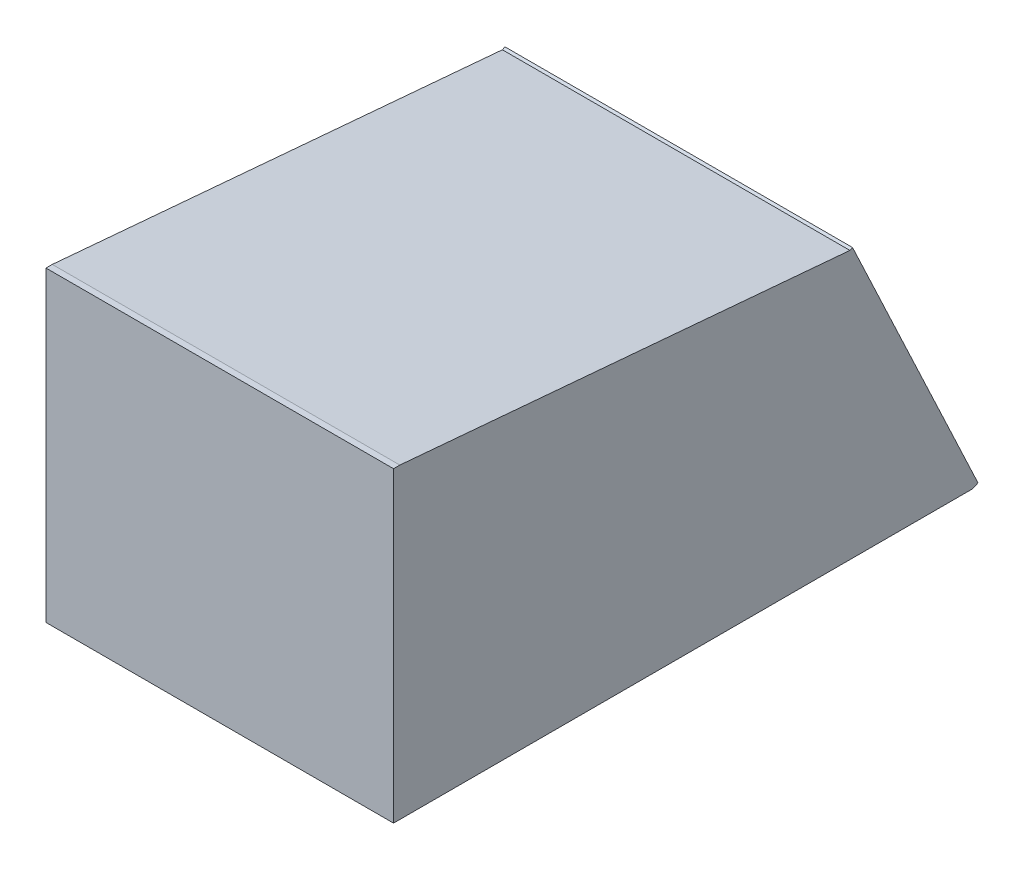
ISO-10303-21;
HEADER;
FILE_DESCRIPTION(('STEP AP214'),'2;1');
FILE_NAME('part.step','',(''),(''),'','','');
FILE_SCHEMA(('AUTOMOTIVE_DESIGN { 1 0 10303 214 1 1 1 1 }'));
ENDSEC;
DATA;
#1=APPLICATION_CONTEXT('core data for automotive mechanical design processes');
#2=APPLICATION_PROTOCOL_DEFINITION('international standard','automotive_design',2000,#1);
#3=PRODUCT_CONTEXT('',#1,'mechanical');
#4=PRODUCT('Part','Part','',(#3));
#5=PRODUCT_RELATED_PRODUCT_CATEGORY('part','',(#4));
#6=PRODUCT_DEFINITION_FORMATION('','',#4);
#7=PRODUCT_DEFINITION_CONTEXT('part definition',#1,'design');
#8=PRODUCT_DEFINITION('design','',#6,#7);
#9=PRODUCT_DEFINITION_SHAPE('','',#8);
#10=(LENGTH_UNIT() NAMED_UNIT(*) SI_UNIT(.MILLI.,.METRE.));
#11=(NAMED_UNIT(*) PLANE_ANGLE_UNIT() SI_UNIT($,.RADIAN.));
#12=(NAMED_UNIT(*) SI_UNIT($,.STERADIAN.) SOLID_ANGLE_UNIT());
#13=UNCERTAINTY_MEASURE_WITH_UNIT(LENGTH_MEASURE(1.E-05),#10,'distance_accuracy_value','');
#14=(GEOMETRIC_REPRESENTATION_CONTEXT(3) GLOBAL_UNCERTAINTY_ASSIGNED_CONTEXT((#13)) GLOBAL_UNIT_ASSIGNED_CONTEXT((#10,
#11,#12)) REPRESENTATION_CONTEXT('',''));
#15=CARTESIAN_POINT('',(0.,0.,0.));
#16=DIRECTION('',(0.,0.,1.));
#17=DIRECTION('',(1.,0.,0.));
#18=AXIS2_PLACEMENT_3D('',#15,#16,#17);
#19=CARTESIAN_POINT('',(5.,-130.,247.5));
#20=DIRECTION('',(0.,1.,0.));
#21=DIRECTION('',(0.,0.,1.));
#22=AXIS2_PLACEMENT_3D('',#19,#20,#21);
#23=PLANE('',#22);
#24=DIRECTION('',(0.,0.,-1.));
#25=VECTOR('',#24,1.);
#26=CARTESIAN_POINT('',(0.,-130.,247.5));
#27=LINE('',#26,#25);
#28=CARTESIAN_POINT('',(0.,-130.,247.5));
#29=VERTEX_POINT('',#28);
#30=CARTESIAN_POINT('',(0.,-130.,-247.5));
#31=VERTEX_POINT('',#30);
#32=EDGE_CURVE('E60',#29,#31,#27,.T.);
#33=ORIENTED_EDGE('',*,*,#32,.T.);
#34=DIRECTION('',(-1.,0.,0.));
#35=VECTOR('',#34,1.);
#36=CARTESIAN_POINT('',(5.,-130.,-247.5));
#37=LINE('',#36,#35);
#38=CARTESIAN_POINT('',(5.,-130.,-247.5));
#39=VERTEX_POINT('',#38);
#40=EDGE_CURVE('E11',#39,#31,#37,.T.);
#41=ORIENTED_EDGE('',*,*,#40,.F.);
#42=DIRECTION('',(0.,0.,-1.));
#43=VECTOR('',#42,1.);
#44=CARTESIAN_POINT('',(5.,-130.,247.5));
#45=LINE('',#44,#43);
#46=CARTESIAN_POINT('',(5.,-130.,252.5));
#47=VERTEX_POINT('',#46);
#48=EDGE_CURVE('E41',#47,#39,#45,.T.);
#49=ORIENTED_EDGE('',*,*,#48,.F.);
#50=DIRECTION('',(1.,0.,0.));
#51=VECTOR('',#50,1.);
#52=CARTESIAN_POINT('',(5.,-130.,252.5));
#53=LINE('',#52,#51);
#54=CARTESIAN_POINT('',(-295.,-130.,252.5));
#55=VERTEX_POINT('',#54);
#56=EDGE_CURVE('E190',#55,#47,#53,.T.);
#57=ORIENTED_EDGE('',*,*,#56,.F.);
#58=DIRECTION('',(0.,0.,1.));
#59=VECTOR('',#58,1.);
#60=CARTESIAN_POINT('',(-295.,-130.,-247.5));
#61=LINE('',#60,#59);
#62=CARTESIAN_POINT('',(-295.,-130.,-247.5));
#63=VERTEX_POINT('',#62);
#64=EDGE_CURVE('E101',#63,#55,#61,.T.);
#65=ORIENTED_EDGE('',*,*,#64,.F.);
#66=DIRECTION('',(-1.,0.,0.));
#67=VECTOR('',#66,1.);
#68=CARTESIAN_POINT('',(-290.,-130.,-247.5));
#69=LINE('',#68,#67);
#70=CARTESIAN_POINT('',(-290.,-130.,-247.5));
#71=VERTEX_POINT('',#70);
#72=EDGE_CURVE('E119',#71,#63,#69,.T.);
#73=ORIENTED_EDGE('',*,*,#72,.F.);
#74=DIRECTION('',(0.,0.,1.));
#75=VECTOR('',#74,1.);
#76=CARTESIAN_POINT('',(-290.,-130.,-247.5));
#77=LINE('',#76,#75);
#78=CARTESIAN_POINT('',(-290.,-130.,247.5));
#79=VERTEX_POINT('',#78);
#80=EDGE_CURVE('E118',#71,#79,#77,.T.);
#81=ORIENTED_EDGE('',*,*,#80,.T.);
#82=DIRECTION('',(1.,0.,0.));
#83=VECTOR('',#82,1.);
#84=CARTESIAN_POINT('',(5.,-130.,247.5));
#85=LINE('',#84,#83);
#86=EDGE_CURVE('E65',#79,#29,#85,.T.);
#87=ORIENTED_EDGE('',*,*,#86,.T.);
#88=EDGE_LOOP('',(#33,#41,#49,#57,#65,#73,#81,#87));
#89=FACE_BOUND('',#88,.T.);
#90=ADVANCED_FACE('F33',(#89),#23,.F.);
#91=CARTESIAN_POINT('',(5.,0.,0.));
#92=DIRECTION('',(1.,0.,0.));
#93=DIRECTION('',(0.,0.,-1.));
#94=AXIS2_PLACEMENT_3D('',#91,#92,#93);
#95=PLANE('',#94);
#96=DIRECTION('',(0.,1.,0.));
#97=VECTOR('',#96,1.);
#98=CARTESIAN_POINT('',(5.,-130.,252.5));
#99=LINE('',#98,#97);
#100=CARTESIAN_POINT('',(5.,134.98118232192,252.5));
#101=VERTEX_POINT('',#100);
#102=EDGE_CURVE('E232',#47,#101,#99,.T.);
#103=ORIENTED_EDGE('',*,*,#102,.F.);
#104=ORIENTED_EDGE('',*,*,#48,.T.);
#105=DIRECTION('',(0.,-0.425871115560859,0.904783837682211));
#106=VECTOR('',#105,1.);
#107=CARTESIAN_POINT('',(5.,-127.870644422196,-252.023919188411));
#108=LINE('',#107,#106);
#109=CARTESIAN_POINT('',(5.,-127.870644422196,-252.023919188411));
#110=VERTEX_POINT('',#109);
#111=EDGE_CURVE('E94',#110,#39,#108,.T.);
#112=ORIENTED_EDGE('',*,*,#111,.F.);
#113=DIRECTION('',(0.,-0.904783837682211,-0.425871115560859));
#114=VECTOR('',#113,1.);
#115=CARTESIAN_POINT('',(5.,-127.870644422196,-252.023919188411));
#116=LINE('',#115,#114);
#117=CARTESIAN_POINT('',(5.,102.236086650973,-143.715386057194));
#118=VERTEX_POINT('',#117);
#119=EDGE_CURVE('E89',#118,#110,#116,.T.);
#120=ORIENTED_EDGE('',*,*,#119,.F.);
#121=DIRECTION('',(0.,-0.425871115560859,0.904783837682211));
#122=VECTOR('',#121,1.);
#123=CARTESIAN_POINT('',(5.,102.236086650973,-143.715386057194));
#124=LINE('',#123,#122);
#125=CARTESIAN_POINT('',(5.,101.177141742473,-141.465606245419));
#126=VERTEX_POINT('',#125);
#127=EDGE_CURVE('E183',#118,#126,#124,.T.);
#128=ORIENTED_EDGE('',*,*,#127,.T.);
#129=DIRECTION('',(0.,-0.086677027126788,-0.996236464384065));
#130=VECTOR('',#129,1.);
#131=CARTESIAN_POINT('',(5.,101.177141742473,-141.465606245419));
#132=LINE('',#131,#130);
#133=CARTESIAN_POINT('',(5.,134.98118232192,247.066614864366));
#134=VERTEX_POINT('',#133);
#135=EDGE_CURVE('E123',#134,#126,#132,.T.);
#136=ORIENTED_EDGE('',*,*,#135,.F.);
#137=DIRECTION('',(0.,0.,1.));
#138=VECTOR('',#137,1.);
#139=CARTESIAN_POINT('',(5.,134.98118232192,-164.618640413779));
#140=LINE('',#139,#138);
#141=EDGE_CURVE('E90',#134,#101,#140,.T.);
#142=ORIENTED_EDGE('',*,*,#141,.T.);
#143=EDGE_LOOP('',(#103,#104,#112,#120,#128,#136,#142));
#144=FACE_BOUND('',#143,.T.);
#145=ADVANCED_FACE('F179',(#144),#95,.T.);
#146=CARTESIAN_POINT('',(0.,0.,0.));
#147=DIRECTION('',(1.,0.,0.));
#148=DIRECTION('',(0.,0.,-1.));
#149=AXIS2_PLACEMENT_3D('',#146,#147,#148);
#150=PLANE('',#149);
#151=DIRECTION('',(0.,0.086677027126788,0.996236464384065));
#152=VECTOR('',#151,1.);
#153=CARTESIAN_POINT('',(0.,96.1959594205527,-141.032221109785));
#154=LINE('',#153,#152);
#155=CARTESIAN_POINT('',(0.,96.1959594205527,-141.032221109785));
#156=VERTEX_POINT('',#155);
#157=CARTESIAN_POINT('',(0.,130.,247.5));
#158=VERTEX_POINT('',#157);
#159=EDGE_CURVE('E76',#156,#158,#154,.T.);
#160=ORIENTED_EDGE('',*,*,#159,.F.);
#161=DIRECTION('',(0.,0.904783837682211,0.425871115560859));
#162=VECTOR('',#161,1.);
#163=CARTESIAN_POINT('',(0.,-130.,-247.5));
#164=LINE('',#163,#162);
#165=EDGE_CURVE('E69',#31,#156,#164,.T.);
#166=ORIENTED_EDGE('',*,*,#165,.F.);
#167=ORIENTED_EDGE('',*,*,#32,.F.);
#168=DIRECTION('',(0.,-1.,0.));
#169=VECTOR('',#168,1.);
#170=CARTESIAN_POINT('',(0.,130.,247.5));
#171=LINE('',#170,#169);
#172=EDGE_CURVE('E70',#158,#29,#171,.T.);
#173=ORIENTED_EDGE('',*,*,#172,.F.);
#174=EDGE_LOOP('',(#160,#166,#167,#173));
#175=FACE_BOUND('',#174,.T.);
#176=ADVANCED_FACE('F74',(#175),#150,.F.);
#177=CARTESIAN_POINT('',(0.,107.651495361492,-9.36616146594905));
#178=DIRECTION('',(0.,-0.996236464384065,0.086677027126788));
#179=DIRECTION('',(0.,-0.086677027126788,-0.996236464384065));
#180=AXIS2_PLACEMENT_3D('',#177,#178,#179);
#181=PLANE('',#180);
#182=DIRECTION('',(0.,-0.0866770271267881,-0.996236464384065));
#183=VECTOR('',#182,1.);
#184=CARTESIAN_POINT('',(-290.,130.,247.5));
#185=LINE('',#184,#183);
#186=CARTESIAN_POINT('',(-290.,130.000000000001,247.5));
#187=VERTEX_POINT('',#186);
#188=CARTESIAN_POINT('',(-290.,96.1959594205527,-141.032221109785));
#189=VERTEX_POINT('',#188);
#190=EDGE_CURVE('E114',#187,#189,#185,.T.);
#191=ORIENTED_EDGE('',*,*,#190,.T.);
#192=DIRECTION('',(-1.,0.,0.));
#193=VECTOR('',#192,1.);
#194=CARTESIAN_POINT('',(5.,96.1959594205527,-141.032221109785));
#195=LINE('',#194,#193);
#196=EDGE_CURVE('E122',#156,#189,#195,.T.);
#197=ORIENTED_EDGE('',*,*,#196,.F.);
#198=ORIENTED_EDGE('',*,*,#159,.T.);
#199=DIRECTION('',(1.,0.,0.));
#200=VECTOR('',#199,1.);
#201=CARTESIAN_POINT('',(5.,130.,247.5));
#202=LINE('',#201,#200);
#203=EDGE_CURVE('E127',#187,#158,#202,.T.);
#204=ORIENTED_EDGE('',*,*,#203,.F.);
#205=EDGE_LOOP('',(#191,#197,#198,#204));
#206=FACE_BOUND('',#205,.T.);
#207=ADVANCED_FACE('F147',(#206),#181,.T.);
#208=CARTESIAN_POINT('',(-295.,101.177141742473,-141.465606245419));
#209=DIRECTION('',(1.,0.,0.));
#210=DIRECTION('',(0.,0.,-1.));
#211=AXIS2_PLACEMENT_3D('',#208,#209,#210);
#212=PLANE('',#211);
#213=DIRECTION('',(0.,0.086677027126788,0.996236464384065));
#214=VECTOR('',#213,1.);
#215=CARTESIAN_POINT('',(-295.,101.177141742473,-141.465606245419));
#216=LINE('',#215,#214);
#217=CARTESIAN_POINT('',(-295.,101.177141742473,-141.465606245419));
#218=VERTEX_POINT('',#217);
#219=CARTESIAN_POINT('',(-295.,134.98118232192,247.066614864366));
#220=VERTEX_POINT('',#219);
#221=EDGE_CURVE('E130',#218,#220,#216,.T.);
#222=ORIENTED_EDGE('',*,*,#221,.F.);
#223=DIRECTION('',(0.,-0.425871115560859,0.904783837682211));
#224=VECTOR('',#223,1.);
#225=CARTESIAN_POINT('',(-295.,102.236086650973,-143.715386057194));
#226=LINE('',#225,#224);
#227=CARTESIAN_POINT('',(-295.,102.236086650973,-143.715386057194));
#228=VERTEX_POINT('',#227);
#229=EDGE_CURVE('E108',#228,#218,#226,.T.);
#230=ORIENTED_EDGE('',*,*,#229,.F.);
#231=DIRECTION('',(0.,0.904783837682211,0.425871115560859));
#232=VECTOR('',#231,1.);
#233=CARTESIAN_POINT('',(-295.,-127.870644422196,-252.023919188411));
#234=LINE('',#233,#232);
#235=CARTESIAN_POINT('',(-295.,-127.870644422196,-252.023919188411));
#236=VERTEX_POINT('',#235);
#237=EDGE_CURVE('E196',#236,#228,#234,.T.);
#238=ORIENTED_EDGE('',*,*,#237,.F.);
#239=DIRECTION('',(0.,-0.425871115560859,0.904783837682211));
#240=VECTOR('',#239,1.);
#241=CARTESIAN_POINT('',(-295.,-127.870644422196,-252.023919188411));
#242=LINE('',#241,#240);
#243=EDGE_CURVE('E102',#236,#63,#242,.T.);
#244=ORIENTED_EDGE('',*,*,#243,.T.);
#245=ORIENTED_EDGE('',*,*,#64,.T.);
#246=DIRECTION('',(0.,-1.,0.));
#247=VECTOR('',#246,1.);
#248=CARTESIAN_POINT('',(-295.,-130.,252.5));
#249=LINE('',#248,#247);
#250=CARTESIAN_POINT('',(-295.,134.98118232192,252.5));
#251=VERTEX_POINT('',#250);
#252=EDGE_CURVE('E230',#251,#55,#249,.T.);
#253=ORIENTED_EDGE('',*,*,#252,.F.);
#254=DIRECTION('',(0.,0.,1.));
#255=VECTOR('',#254,1.);
#256=CARTESIAN_POINT('',(-295.,134.98118232192,-164.618640413779));
#257=LINE('',#256,#255);
#258=EDGE_CURVE('E188',#220,#251,#257,.T.);
#259=ORIENTED_EDGE('',*,*,#258,.F.);
#260=EDGE_LOOP('',(#222,#230,#238,#244,#245,#253,#259));
#261=FACE_BOUND('',#260,.T.);
#262=ADVANCED_FACE('F210',(#261),#212,.F.);
#263=CARTESIAN_POINT('',(0.,112.632677683413,-9.79954660158299));
#264=DIRECTION('',(0.,-0.996236464384065,0.086677027126788));
#265=DIRECTION('',(0.,-0.086677027126788,-0.996236464384065));
#266=AXIS2_PLACEMENT_3D('',#263,#264,#265);
#267=PLANE('',#266);
#268=ORIENTED_EDGE('',*,*,#135,.T.);
#269=DIRECTION('',(-1.,0.,0.));
#270=VECTOR('',#269,1.);
#271=CARTESIAN_POINT('',(5.,101.177141742473,-141.465606245419));
#272=LINE('',#271,#270);
#273=EDGE_CURVE('E126',#126,#218,#272,.T.);
#274=ORIENTED_EDGE('',*,*,#273,.T.);
#275=ORIENTED_EDGE('',*,*,#221,.T.);
#276=DIRECTION('',(1.,0.,0.));
#277=VECTOR('',#276,1.);
#278=CARTESIAN_POINT('',(5.,134.98118232192,247.066614864366));
#279=LINE('',#278,#277);
#280=EDGE_CURVE('E133',#220,#134,#279,.T.);
#281=ORIENTED_EDGE('',*,*,#280,.T.);
#282=EDGE_LOOP('',(#268,#274,#275,#281));
#283=FACE_BOUND('',#282,.T.);
#284=ADVANCED_FACE('F170',(#283),#267,.F.);
#285=CARTESIAN_POINT('',(-290.,0.,0.));
#286=DIRECTION('',(1.,0.,0.));
#287=DIRECTION('',(0.,0.,-1.));
#288=AXIS2_PLACEMENT_3D('',#285,#286,#287);
#289=PLANE('',#288);
#290=DIRECTION('',(0.,1.,0.));
#291=VECTOR('',#290,1.);
#292=CARTESIAN_POINT('',(-290.,-130.,247.5));
#293=LINE('',#292,#291);
#294=EDGE_CURVE('E105',#79,#187,#293,.T.);
#295=ORIENTED_EDGE('',*,*,#294,.F.);
#296=ORIENTED_EDGE('',*,*,#80,.F.);
#297=DIRECTION('',(0.,-0.904783837682211,-0.425871115560859));
#298=VECTOR('',#297,1.);
#299=CARTESIAN_POINT('',(-290.,96.1959594205527,-141.032221109785));
#300=LINE('',#299,#298);
#301=EDGE_CURVE('E86',#189,#71,#300,.T.);
#302=ORIENTED_EDGE('',*,*,#301,.F.);
#303=ORIENTED_EDGE('',*,*,#190,.F.);
#304=EDGE_LOOP('',(#295,#296,#302,#303));
#305=FACE_BOUND('',#304,.T.);
#306=ADVANCED_FACE('F238',(#305),#289,.T.);
#307=CARTESIAN_POINT('',(5.,102.236086650973,-143.715386057194));
#308=DIRECTION('',(0.,-0.904783837682211,-0.425871115560859));
#309=DIRECTION('',(0.,0.425871115560859,-0.904783837682211));
#310=AXIS2_PLACEMENT_3D('',#307,#308,#309);
#311=PLANE('',#310);
#312=ORIENTED_EDGE('',*,*,#229,.T.);
#313=ORIENTED_EDGE('',*,*,#273,.F.);
#314=ORIENTED_EDGE('',*,*,#127,.F.);
#315=DIRECTION('',(1.,0.,0.));
#316=VECTOR('',#315,1.);
#317=CARTESIAN_POINT('',(5.,102.236086650973,-143.715386057194));
#318=LINE('',#317,#316);
#319=EDGE_CURVE('E199',#228,#118,#318,.T.);
#320=ORIENTED_EDGE('',*,*,#319,.F.);
#321=EDGE_LOOP('',(#312,#313,#314,#320));
#322=FACE_BOUND('',#321,.T.);
#323=ADVANCED_FACE('F206',(#322),#311,.F.);
#324=CARTESIAN_POINT('',(0.,71.7894153990751,-152.520094452039));
#325=DIRECTION('',(0.,-0.425871115560859,0.904783837682211));
#326=DIRECTION('',(0.,-0.904783837682211,-0.425871115560859));
#327=AXIS2_PLACEMENT_3D('',#324,#325,#326);
#328=PLANE('',#327);
#329=ORIENTED_EDGE('',*,*,#165,.T.);
#330=ORIENTED_EDGE('',*,*,#196,.T.);
#331=ORIENTED_EDGE('',*,*,#301,.T.);
#332=DIRECTION('',(-1.,0.,0.));
#333=VECTOR('',#332,1.);
#334=CARTESIAN_POINT('',(5.,-130.,-247.5));
#335=LINE('',#334,#333);
#336=EDGE_CURVE('E82',#31,#71,#335,.T.);
#337=ORIENTED_EDGE('',*,*,#336,.F.);
#338=EDGE_LOOP('',(#329,#330,#331,#337));
#339=FACE_BOUND('',#338,.T.);
#340=ADVANCED_FACE('F83',(#339),#328,.T.);
#341=CARTESIAN_POINT('',(5.,-127.870644422196,-252.023919188411));
#342=DIRECTION('',(0.,0.904783837682211,0.425871115560859));
#343=DIRECTION('',(0.,-0.425871115560859,0.904783837682211));
#344=AXIS2_PLACEMENT_3D('',#341,#342,#343);
#345=PLANE('',#344);
#346=ORIENTED_EDGE('',*,*,#40,.T.);
#347=ORIENTED_EDGE('',*,*,#336,.T.);
#348=ORIENTED_EDGE('',*,*,#72,.T.);
#349=ORIENTED_EDGE('',*,*,#243,.F.);
#350=DIRECTION('',(-1.,0.,0.));
#351=VECTOR('',#350,1.);
#352=CARTESIAN_POINT('',(5.,-127.870644422196,-252.023919188411));
#353=LINE('',#352,#351);
#354=EDGE_CURVE('E98',#110,#236,#353,.T.);
#355=ORIENTED_EDGE('',*,*,#354,.F.);
#356=ORIENTED_EDGE('',*,*,#111,.T.);
#357=EDGE_LOOP('',(#346,#347,#348,#349,#355,#356));
#358=FACE_BOUND('',#357,.T.);
#359=ADVANCED_FACE('F92',(#358),#345,.F.);
#360=CARTESIAN_POINT('',(0.,73.9187709768794,-157.04401364045));
#361=DIRECTION('',(0.,-0.425871115560859,0.904783837682211));
#362=DIRECTION('',(0.,-0.904783837682211,-0.425871115560859));
#363=AXIS2_PLACEMENT_3D('',#360,#361,#362);
#364=PLANE('',#363);
#365=ORIENTED_EDGE('',*,*,#119,.T.);
#366=ORIENTED_EDGE('',*,*,#354,.T.);
#367=ORIENTED_EDGE('',*,*,#237,.T.);
#368=ORIENTED_EDGE('',*,*,#319,.T.);
#369=EDGE_LOOP('',(#365,#366,#367,#368));
#370=FACE_BOUND('',#369,.T.);
#371=ADVANCED_FACE('F288',(#370),#364,.F.);
#372=CARTESIAN_POINT('',(0.,0.,247.5));
#373=DIRECTION('',(0.,0.,1.));
#374=DIRECTION('',(1.,0.,0.));
#375=AXIS2_PLACEMENT_3D('',#372,#373,#374);
#376=PLANE('',#375);
#377=ORIENTED_EDGE('',*,*,#203,.T.);
#378=ORIENTED_EDGE('',*,*,#172,.T.);
#379=ORIENTED_EDGE('',*,*,#86,.F.);
#380=ORIENTED_EDGE('',*,*,#294,.T.);
#381=EDGE_LOOP('',(#377,#378,#379,#380));
#382=FACE_BOUND('',#381,.T.);
#383=ADVANCED_FACE('F142',(#382),#376,.F.);
#384=CARTESIAN_POINT('',(5.,134.98118232192,-164.618640413779));
#385=DIRECTION('',(0.,1.,0.));
#386=DIRECTION('',(-1.,0.,0.));
#387=AXIS2_PLACEMENT_3D('',#384,#385,#386);
#388=PLANE('',#387);
#389=ORIENTED_EDGE('',*,*,#141,.F.);
#390=ORIENTED_EDGE('',*,*,#280,.F.);
#391=ORIENTED_EDGE('',*,*,#258,.T.);
#392=DIRECTION('',(-1.,0.,0.));
#393=VECTOR('',#392,1.);
#394=CARTESIAN_POINT('',(5.,134.98118232192,252.5));
#395=LINE('',#394,#393);
#396=EDGE_CURVE('E186',#101,#251,#395,.T.);
#397=ORIENTED_EDGE('',*,*,#396,.F.);
#398=EDGE_LOOP('',(#389,#390,#391,#397));
#399=FACE_BOUND('',#398,.T.);
#400=ADVANCED_FACE('F184',(#399),#388,.T.);
#401=CARTESIAN_POINT('',(0.,0.,252.5));
#402=DIRECTION('',(0.,0.,1.));
#403=DIRECTION('',(1.,0.,0.));
#404=AXIS2_PLACEMENT_3D('',#401,#402,#403);
#405=PLANE('',#404);
#406=ORIENTED_EDGE('',*,*,#102,.T.);
#407=ORIENTED_EDGE('',*,*,#396,.T.);
#408=ORIENTED_EDGE('',*,*,#252,.T.);
#409=ORIENTED_EDGE('',*,*,#56,.T.);
#410=EDGE_LOOP('',(#406,#407,#408,#409));
#411=FACE_BOUND('',#410,.T.);
#412=ADVANCED_FACE('F228',(#411),#405,.T.);
#413=CLOSED_SHELL('',(#90,#145,#176,#207,#262,#284,#306,#323,#340,#359,#371,#383,#400,#412));
#414=MANIFOLD_SOLID_BREP('B2',#413);
#415=ADVANCED_BREP_SHAPE_REPRESENTATION('',(#18,#414),#14);
#416=SHAPE_DEFINITION_REPRESENTATION(#9,#415);
ENDSEC;
END-ISO-10303-21;
